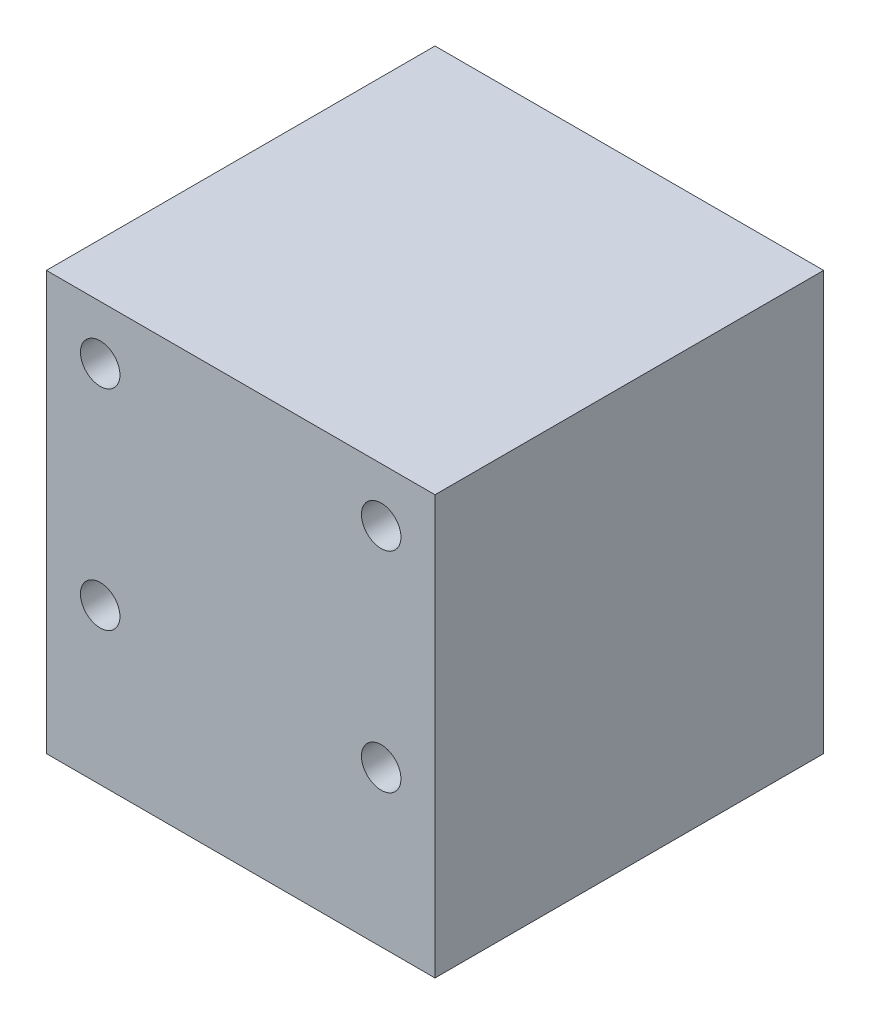
ISO-10303-21;
HEADER;
FILE_DESCRIPTION(('STEP AP214'),'2;1');
FILE_NAME('part.step','',(''),(''),'','','');
FILE_SCHEMA(('AUTOMOTIVE_DESIGN { 1 0 10303 214 1 1 1 1 }'));
ENDSEC;
DATA;
#1=APPLICATION_CONTEXT('core data for automotive mechanical design processes');
#2=APPLICATION_PROTOCOL_DEFINITION('international standard','automotive_design',2000,#1);
#3=PRODUCT_CONTEXT('',#1,'mechanical');
#4=PRODUCT('Part','Part','',(#3));
#5=PRODUCT_RELATED_PRODUCT_CATEGORY('part','',(#4));
#6=PRODUCT_DEFINITION_FORMATION('','',#4);
#7=PRODUCT_DEFINITION_CONTEXT('part definition',#1,'design');
#8=PRODUCT_DEFINITION('design','',#6,#7);
#9=PRODUCT_DEFINITION_SHAPE('','',#8);
#10=(LENGTH_UNIT() NAMED_UNIT(*) SI_UNIT(.MILLI.,.METRE.));
#11=(NAMED_UNIT(*) PLANE_ANGLE_UNIT() SI_UNIT($,.RADIAN.));
#12=(NAMED_UNIT(*) SI_UNIT($,.STERADIAN.) SOLID_ANGLE_UNIT());
#13=UNCERTAINTY_MEASURE_WITH_UNIT(LENGTH_MEASURE(1.E-05),#10,'distance_accuracy_value','');
#14=(GEOMETRIC_REPRESENTATION_CONTEXT(3) GLOBAL_UNCERTAINTY_ASSIGNED_CONTEXT((#13)) GLOBAL_UNIT_ASSIGNED_CONTEXT((#10,
#11,#12)) REPRESENTATION_CONTEXT('',''));
#15=CARTESIAN_POINT('',(0.,0.,0.));
#16=DIRECTION('',(0.,0.,1.));
#17=DIRECTION('',(1.,0.,0.));
#18=AXIS2_PLACEMENT_3D('',#15,#16,#17);
#19=CARTESIAN_POINT('',(0.,35.,0.));
#20=DIRECTION('',(1.,0.,0.));
#21=DIRECTION('',(0.,0.,-1.));
#22=AXIS2_PLACEMENT_3D('',#19,#20,#21);
#23=PLANE('',#22);
#24=DIRECTION('',(0.,0.,1.));
#25=VECTOR('',#24,1.);
#26=CARTESIAN_POINT('',(0.,0.,0.));
#27=LINE('',#26,#25);
#28=CARTESIAN_POINT('',(0.,0.,-32.5));
#29=VERTEX_POINT('',#28);
#30=CARTESIAN_POINT('',(0.,0.,0.));
#31=VERTEX_POINT('',#30);
#32=EDGE_CURVE('E114',#29,#31,#27,.T.);
#33=ORIENTED_EDGE('',*,*,#32,.T.);
#34=DIRECTION('',(0.,-1.,0.));
#35=VECTOR('',#34,1.);
#36=CARTESIAN_POINT('',(0.,35.,0.));
#37=LINE('',#36,#35);
#38=CARTESIAN_POINT('',(0.,35.,0.));
#39=VERTEX_POINT('',#38);
#40=EDGE_CURVE('E11',#39,#31,#37,.T.);
#41=ORIENTED_EDGE('',*,*,#40,.F.);
#42=DIRECTION('',(0.,0.,1.));
#43=VECTOR('',#42,1.);
#44=CARTESIAN_POINT('',(0.,35.,0.));
#45=LINE('',#44,#43);
#46=CARTESIAN_POINT('',(0.,35.,-32.5));
#47=VERTEX_POINT('',#46);
#48=EDGE_CURVE('E100',#47,#39,#45,.T.);
#49=ORIENTED_EDGE('',*,*,#48,.F.);
#50=DIRECTION('',(0.,-1.,0.));
#51=VECTOR('',#50,1.);
#52=CARTESIAN_POINT('',(0.,35.,-32.5));
#53=LINE('',#52,#51);
#54=EDGE_CURVE('E108',#47,#29,#53,.T.);
#55=ORIENTED_EDGE('',*,*,#54,.T.);
#56=EDGE_LOOP('',(#33,#41,#49,#55));
#57=FACE_BOUND('',#56,.T.);
#58=ADVANCED_FACE('F44',(#57),#23,.F.);
#59=CARTESIAN_POINT('',(0.,35.,0.));
#60=DIRECTION('',(0.,0.,-1.));
#61=DIRECTION('',(-1.,0.,0.));
#62=AXIS2_PLACEMENT_3D('',#59,#60,#61);
#63=PLANE('',#62);
#64=CARTESIAN_POINT('',(28.,30.5,0.));
#65=DIRECTION('',(0.,0.,1.));
#66=DIRECTION('',(1.,0.,0.));
#67=AXIS2_PLACEMENT_3D('',#64,#65,#66);
#68=CIRCLE('',#67,1.65);
#69=CARTESIAN_POINT('',(29.65,30.5,0.));
#70=VERTEX_POINT('',#69);
#71=EDGE_CURVE('E140',#70,#70,#68,.T.);
#72=ORIENTED_EDGE('',*,*,#71,.F.);
#73=EDGE_LOOP('',(#72));
#74=FACE_BOUND('',#73,.T.);
#75=CARTESIAN_POINT('',(4.5,13.,0.));
#76=DIRECTION('',(0.,0.,1.));
#77=DIRECTION('',(1.,0.,0.));
#78=AXIS2_PLACEMENT_3D('',#75,#76,#77);
#79=CIRCLE('',#78,1.65);
#80=CARTESIAN_POINT('',(6.15,13.,0.));
#81=VERTEX_POINT('',#80);
#82=EDGE_CURVE('E148',#81,#81,#79,.T.);
#83=ORIENTED_EDGE('',*,*,#82,.F.);
#84=EDGE_LOOP('',(#83));
#85=FACE_BOUND('',#84,.T.);
#86=CARTESIAN_POINT('',(28.,13.,0.));
#87=DIRECTION('',(0.,0.,1.));
#88=DIRECTION('',(1.,0.,0.));
#89=AXIS2_PLACEMENT_3D('',#86,#87,#88);
#90=CIRCLE('',#89,1.65);
#91=CARTESIAN_POINT('',(29.65,13.,0.));
#92=VERTEX_POINT('',#91);
#93=EDGE_CURVE('E150',#92,#92,#90,.T.);
#94=ORIENTED_EDGE('',*,*,#93,.F.);
#95=EDGE_LOOP('',(#94));
#96=FACE_BOUND('',#95,.T.);
#97=CARTESIAN_POINT('',(4.5,30.5,0.));
#98=DIRECTION('',(0.,0.,1.));
#99=DIRECTION('',(1.,0.,0.));
#100=AXIS2_PLACEMENT_3D('',#97,#98,#99);
#101=CIRCLE('',#100,1.65);
#102=CARTESIAN_POINT('',(6.15,30.5,0.));
#103=VERTEX_POINT('',#102);
#104=EDGE_CURVE('E133',#103,#103,#101,.T.);
#105=ORIENTED_EDGE('',*,*,#104,.F.);
#106=EDGE_LOOP('',(#105));
#107=FACE_BOUND('',#106,.T.);
#108=DIRECTION('',(1.,0.,0.));
#109=VECTOR('',#108,1.);
#110=CARTESIAN_POINT('',(0.,0.,0.));
#111=LINE('',#110,#109);
#112=CARTESIAN_POINT('',(32.5,0.,0.));
#113=VERTEX_POINT('',#112);
#114=EDGE_CURVE('E105',#31,#113,#111,.T.);
#115=ORIENTED_EDGE('',*,*,#114,.T.);
#116=DIRECTION('',(0.,-1.,0.));
#117=VECTOR('',#116,1.);
#118=CARTESIAN_POINT('',(32.5,35.,0.));
#119=LINE('',#118,#117);
#120=CARTESIAN_POINT('',(32.5,35.,0.));
#121=VERTEX_POINT('',#120);
#122=EDGE_CURVE('E53',#121,#113,#119,.T.);
#123=ORIENTED_EDGE('',*,*,#122,.F.);
#124=DIRECTION('',(1.,0.,0.));
#125=VECTOR('',#124,1.);
#126=CARTESIAN_POINT('',(0.,35.,0.));
#127=LINE('',#126,#125);
#128=EDGE_CURVE('E95',#39,#121,#127,.T.);
#129=ORIENTED_EDGE('',*,*,#128,.F.);
#130=ORIENTED_EDGE('',*,*,#40,.T.);
#131=EDGE_LOOP('',(#115,#123,#129,#130));
#132=FACE_BOUND('',#131,.T.);
#133=ADVANCED_FACE('F101',(#74,#85,#96,#107,#132),#63,.F.);
#134=CARTESIAN_POINT('',(32.5,35.,0.));
#135=DIRECTION('',(-1.,0.,0.));
#136=DIRECTION('',(0.,0.,1.));
#137=AXIS2_PLACEMENT_3D('',#134,#135,#136);
#138=PLANE('',#137);
#139=DIRECTION('',(0.,0.,-1.));
#140=VECTOR('',#139,1.);
#141=CARTESIAN_POINT('',(32.5,0.,0.));
#142=LINE('',#141,#140);
#143=CARTESIAN_POINT('',(32.5,0.,-32.5));
#144=VERTEX_POINT('',#143);
#145=EDGE_CURVE('E78',#113,#144,#142,.T.);
#146=ORIENTED_EDGE('',*,*,#145,.T.);
#147=DIRECTION('',(0.,-1.,0.));
#148=VECTOR('',#147,1.);
#149=CARTESIAN_POINT('',(32.5,35.,-32.5));
#150=LINE('',#149,#148);
#151=CARTESIAN_POINT('',(32.5,35.,-32.5));
#152=VERTEX_POINT('',#151);
#153=EDGE_CURVE('E102',#152,#144,#150,.T.);
#154=ORIENTED_EDGE('',*,*,#153,.F.);
#155=DIRECTION('',(0.,0.,-1.));
#156=VECTOR('',#155,1.);
#157=CARTESIAN_POINT('',(32.5,35.,0.));
#158=LINE('',#157,#156);
#159=EDGE_CURVE('E92',#121,#152,#158,.T.);
#160=ORIENTED_EDGE('',*,*,#159,.F.);
#161=ORIENTED_EDGE('',*,*,#122,.T.);
#162=EDGE_LOOP('',(#146,#154,#160,#161));
#163=FACE_BOUND('',#162,.T.);
#164=ADVANCED_FACE('F104',(#163),#138,.F.);
#165=CARTESIAN_POINT('',(0.,35.,-32.5));
#166=DIRECTION('',(0.,0.,1.));
#167=DIRECTION('',(1.,0.,0.));
#168=AXIS2_PLACEMENT_3D('',#165,#166,#167);
#169=PLANE('',#168);
#170=DIRECTION('',(-1.,0.,0.));
#171=VECTOR('',#170,1.);
#172=CARTESIAN_POINT('',(0.,0.,-32.5));
#173=LINE('',#172,#171);
#174=EDGE_CURVE('E82',#144,#29,#173,.T.);
#175=ORIENTED_EDGE('',*,*,#174,.T.);
#176=ORIENTED_EDGE('',*,*,#54,.F.);
#177=DIRECTION('',(-1.,0.,0.));
#178=VECTOR('',#177,1.);
#179=CARTESIAN_POINT('',(0.,35.,-32.5));
#180=LINE('',#179,#178);
#181=EDGE_CURVE('E61',#152,#47,#180,.T.);
#182=ORIENTED_EDGE('',*,*,#181,.F.);
#183=ORIENTED_EDGE('',*,*,#153,.T.);
#184=EDGE_LOOP('',(#175,#176,#182,#183));
#185=FACE_BOUND('',#184,.T.);
#186=ADVANCED_FACE('F130',(#185),#169,.F.);
#187=CARTESIAN_POINT('',(0.,35.,0.));
#188=DIRECTION('',(0.,-1.,0.));
#189=DIRECTION('',(0.,0.,-1.));
#190=AXIS2_PLACEMENT_3D('',#187,#188,#189);
#191=PLANE('',#190);
#192=ORIENTED_EDGE('',*,*,#48,.T.);
#193=ORIENTED_EDGE('',*,*,#128,.T.);
#194=ORIENTED_EDGE('',*,*,#159,.T.);
#195=ORIENTED_EDGE('',*,*,#181,.T.);
#196=EDGE_LOOP('',(#192,#193,#194,#195));
#197=FACE_BOUND('',#196,.T.);
#198=ADVANCED_FACE('F91',(#197),#191,.F.);
#199=CARTESIAN_POINT('',(0.,0.,0.));
#200=DIRECTION('',(0.,-1.,0.));
#201=DIRECTION('',(0.,0.,-1.));
#202=AXIS2_PLACEMENT_3D('',#199,#200,#201);
#203=PLANE('',#202);
#204=ORIENTED_EDGE('',*,*,#32,.F.);
#205=ORIENTED_EDGE('',*,*,#174,.F.);
#206=ORIENTED_EDGE('',*,*,#145,.F.);
#207=ORIENTED_EDGE('',*,*,#114,.F.);
#208=EDGE_LOOP('',(#204,#205,#206,#207));
#209=FACE_BOUND('',#208,.T.);
#210=ADVANCED_FACE('F128',(#209),#203,.T.);
#211=CARTESIAN_POINT('',(4.5,30.5,-5.));
#212=DIRECTION('',(0.,0.,1.));
#213=DIRECTION('',(1.,0.,0.));
#214=AXIS2_PLACEMENT_3D('',#211,#212,#213);
#215=CYLINDRICAL_SURFACE('',#214,1.65);
#216=CARTESIAN_POINT('',(4.5,30.5,-5.));
#217=DIRECTION('',(0.,0.,1.));
#218=DIRECTION('',(1.,0.,0.));
#219=AXIS2_PLACEMENT_3D('',#216,#217,#218);
#220=CIRCLE('',#219,1.65);
#221=CARTESIAN_POINT('',(6.15,30.5,-5.));
#222=VERTEX_POINT('',#221);
#223=EDGE_CURVE('E116',#222,#222,#220,.T.);
#224=ORIENTED_EDGE('',*,*,#223,.F.);
#225=EDGE_LOOP('',(#224));
#226=FACE_BOUND('',#225,.T.);
#227=ORIENTED_EDGE('',*,*,#104,.T.);
#228=EDGE_LOOP('',(#227));
#229=FACE_BOUND('',#228,.T.);
#230=ADVANCED_FACE('F175',(#226,#229),#215,.F.);
#231=CARTESIAN_POINT('',(4.5,30.5,-5.));
#232=DIRECTION('',(0.,0.,1.));
#233=DIRECTION('',(1.,0.,0.));
#234=AXIS2_PLACEMENT_3D('',#231,#232,#233);
#235=PLANE('',#234);
#236=ORIENTED_EDGE('',*,*,#223,.T.);
#237=EDGE_LOOP('',(#236));
#238=FACE_BOUND('',#237,.T.);
#239=ADVANCED_FACE('F172',(#238),#235,.T.);
#240=CARTESIAN_POINT('',(28.,13.,-5.));
#241=DIRECTION('',(0.,0.,1.));
#242=DIRECTION('',(1.,0.,0.));
#243=AXIS2_PLACEMENT_3D('',#240,#241,#242);
#244=CYLINDRICAL_SURFACE('',#243,1.65);
#245=CARTESIAN_POINT('',(28.,13.,-5.));
#246=DIRECTION('',(0.,0.,1.));
#247=DIRECTION('',(1.,0.,0.));
#248=AXIS2_PLACEMENT_3D('',#245,#246,#247);
#249=CIRCLE('',#248,1.65);
#250=CARTESIAN_POINT('',(29.65,13.,-5.));
#251=VERTEX_POINT('',#250);
#252=EDGE_CURVE('E158',#251,#251,#249,.T.);
#253=ORIENTED_EDGE('',*,*,#252,.F.);
#254=EDGE_LOOP('',(#253));
#255=FACE_BOUND('',#254,.T.);
#256=ORIENTED_EDGE('',*,*,#93,.T.);
#257=EDGE_LOOP('',(#256));
#258=FACE_BOUND('',#257,.T.);
#259=ADVANCED_FACE('F167',(#255,#258),#244,.F.);
#260=CARTESIAN_POINT('',(28.,13.,-5.));
#261=DIRECTION('',(0.,0.,1.));
#262=DIRECTION('',(1.,0.,0.));
#263=AXIS2_PLACEMENT_3D('',#260,#261,#262);
#264=PLANE('',#263);
#265=ORIENTED_EDGE('',*,*,#252,.T.);
#266=EDGE_LOOP('',(#265));
#267=FACE_BOUND('',#266,.T.);
#268=ADVANCED_FACE('F245',(#267),#264,.T.);
#269=CARTESIAN_POINT('',(4.5,13.,-5.));
#270=DIRECTION('',(0.,0.,1.));
#271=DIRECTION('',(1.,0.,0.));
#272=AXIS2_PLACEMENT_3D('',#269,#270,#271);
#273=CYLINDRICAL_SURFACE('',#272,1.65);
#274=CARTESIAN_POINT('',(4.5,13.,-5.));
#275=DIRECTION('',(0.,0.,1.));
#276=DIRECTION('',(1.,0.,0.));
#277=AXIS2_PLACEMENT_3D('',#274,#275,#276);
#278=CIRCLE('',#277,1.65);
#279=CARTESIAN_POINT('',(6.15,13.,-5.));
#280=VERTEX_POINT('',#279);
#281=EDGE_CURVE('E142',#280,#280,#278,.T.);
#282=ORIENTED_EDGE('',*,*,#281,.F.);
#283=EDGE_LOOP('',(#282));
#284=FACE_BOUND('',#283,.T.);
#285=ORIENTED_EDGE('',*,*,#82,.T.);
#286=EDGE_LOOP('',(#285));
#287=FACE_BOUND('',#286,.T.);
#288=ADVANCED_FACE('F252',(#284,#287),#273,.F.);
#289=CARTESIAN_POINT('',(4.5,13.,-5.));
#290=DIRECTION('',(0.,0.,1.));
#291=DIRECTION('',(1.,0.,0.));
#292=AXIS2_PLACEMENT_3D('',#289,#290,#291);
#293=PLANE('',#292);
#294=ORIENTED_EDGE('',*,*,#281,.T.);
#295=EDGE_LOOP('',(#294));
#296=FACE_BOUND('',#295,.T.);
#297=ADVANCED_FACE('F261',(#296),#293,.T.);
#298=CARTESIAN_POINT('',(28.,30.5,-5.));
#299=DIRECTION('',(0.,0.,1.));
#300=DIRECTION('',(1.,0.,0.));
#301=AXIS2_PLACEMENT_3D('',#298,#299,#300);
#302=CYLINDRICAL_SURFACE('',#301,1.65);
#303=CARTESIAN_POINT('',(28.,30.5,-5.));
#304=DIRECTION('',(0.,0.,1.));
#305=DIRECTION('',(1.,0.,0.));
#306=AXIS2_PLACEMENT_3D('',#303,#304,#305);
#307=CIRCLE('',#306,1.65);
#308=CARTESIAN_POINT('',(29.65,30.5,-5.));
#309=VERTEX_POINT('',#308);
#310=EDGE_CURVE('E151',#309,#309,#307,.T.);
#311=ORIENTED_EDGE('',*,*,#310,.F.);
#312=EDGE_LOOP('',(#311));
#313=FACE_BOUND('',#312,.T.);
#314=ORIENTED_EDGE('',*,*,#71,.T.);
#315=EDGE_LOOP('',(#314));
#316=FACE_BOUND('',#315,.T.);
#317=ADVANCED_FACE('F269',(#313,#316),#302,.F.);
#318=CARTESIAN_POINT('',(28.,30.5,-5.));
#319=DIRECTION('',(0.,0.,1.));
#320=DIRECTION('',(1.,0.,0.));
#321=AXIS2_PLACEMENT_3D('',#318,#319,#320);
#322=PLANE('',#321);
#323=ORIENTED_EDGE('',*,*,#310,.T.);
#324=EDGE_LOOP('',(#323));
#325=FACE_BOUND('',#324,.T.);
#326=ADVANCED_FACE('F276',(#325),#322,.T.);
#327=CLOSED_SHELL('',(#58,#133,#164,#186,#198,#210,#230,#239,#259,#268,#288,#297,#317,#326));
#328=MANIFOLD_SOLID_BREP('B2',#327);
#329=ADVANCED_BREP_SHAPE_REPRESENTATION('',(#18,#328),#14);
#330=SHAPE_DEFINITION_REPRESENTATION(#9,#329);
ENDSEC;
END-ISO-10303-21;
